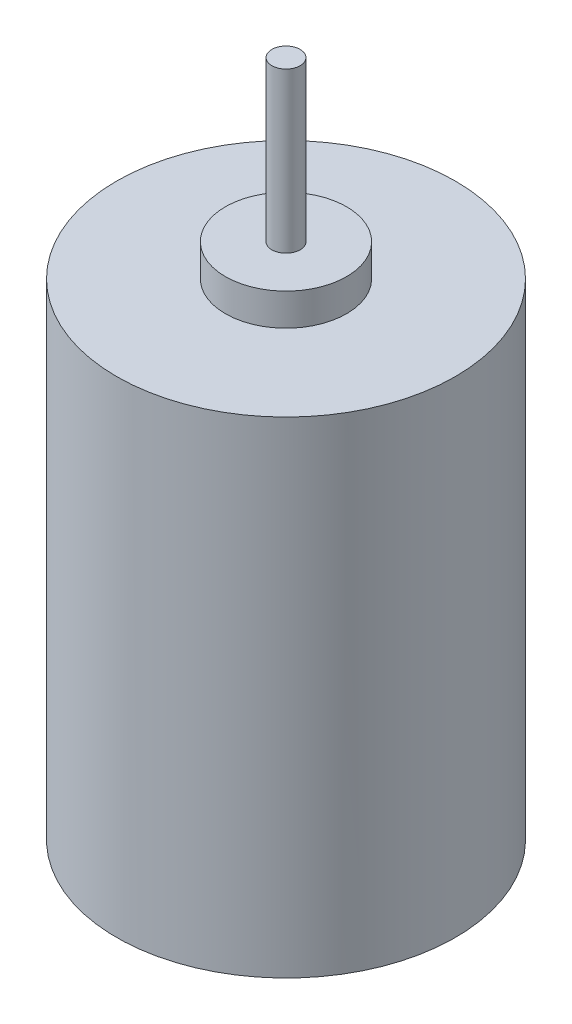
ISO-10303-21;
HEADER;
FILE_DESCRIPTION(('STEP AP214'),'2;1');
FILE_NAME('part.step','',(''),(''),'','','');
FILE_SCHEMA(('AUTOMOTIVE_DESIGN { 1 0 10303 214 1 1 1 1 }'));
ENDSEC;
DATA;
#1=APPLICATION_CONTEXT('core data for automotive mechanical design processes');
#2=APPLICATION_PROTOCOL_DEFINITION('international standard','automotive_design',2000,#1);
#3=PRODUCT_CONTEXT('',#1,'mechanical');
#4=PRODUCT('Part','Part','',(#3));
#5=PRODUCT_RELATED_PRODUCT_CATEGORY('part','',(#4));
#6=PRODUCT_DEFINITION_FORMATION('','',#4);
#7=PRODUCT_DEFINITION_CONTEXT('part definition',#1,'design');
#8=PRODUCT_DEFINITION('design','',#6,#7);
#9=PRODUCT_DEFINITION_SHAPE('','',#8);
#10=(LENGTH_UNIT() NAMED_UNIT(*) SI_UNIT(.MILLI.,.METRE.));
#11=(NAMED_UNIT(*) PLANE_ANGLE_UNIT() SI_UNIT($,.RADIAN.));
#12=(NAMED_UNIT(*) SI_UNIT($,.STERADIAN.) SOLID_ANGLE_UNIT());
#13=UNCERTAINTY_MEASURE_WITH_UNIT(LENGTH_MEASURE(1.E-05),#10,'distance_accuracy_value','');
#14=(GEOMETRIC_REPRESENTATION_CONTEXT(3) GLOBAL_UNCERTAINTY_ASSIGNED_CONTEXT((#13)) GLOBAL_UNIT_ASSIGNED_CONTEXT((#10,
#11,#12)) REPRESENTATION_CONTEXT('',''));
#15=CARTESIAN_POINT('',(0.,0.,0.));
#16=DIRECTION('',(0.,0.,1.));
#17=DIRECTION('',(1.,0.,0.));
#18=AXIS2_PLACEMENT_3D('',#15,#16,#17);
#19=CARTESIAN_POINT('',(0.,57.000000046,0.));
#20=DIRECTION('',(0.,-1.,0.));
#21=DIRECTION('',(0.,0.,-1.));
#22=AXIS2_PLACEMENT_3D('',#19,#20,#21);
#23=CYLINDRICAL_SURFACE('',#22,13.700000032);
#24=CARTESIAN_POINT('',(0.,41.499999804,0.));
#25=DIRECTION('',(0.,1.,0.));
#26=DIRECTION('',(0.,0.,1.));
#27=AXIS2_PLACEMENT_3D('',#24,#25,#26);
#28=CIRCLE('',#27,13.700000032);
#29=CARTESIAN_POINT('',(0.,41.499999804,13.700000032));
#30=VERTEX_POINT('',#29);
#31=EDGE_CURVE('E48',#30,#30,#28,.T.);
#32=ORIENTED_EDGE('',*,*,#31,.F.);
#33=EDGE_LOOP('',(#32));
#34=FACE_BOUND('',#33,.T.);
#35=CARTESIAN_POINT('',(0.,2.200000172,0.));
#36=DIRECTION('',(0.,-1.,0.));
#37=DIRECTION('',(0.,0.,-1.));
#38=AXIS2_PLACEMENT_3D('',#35,#36,#37);
#39=CIRCLE('',#38,13.700000032);
#40=CARTESIAN_POINT('',(0.,2.200000172,-13.700000032));
#41=VERTEX_POINT('',#40);
#42=EDGE_CURVE('E39',#41,#41,#39,.T.);
#43=ORIENTED_EDGE('',*,*,#42,.F.);
#44=EDGE_LOOP('',(#43));
#45=FACE_BOUND('',#44,.T.);
#46=ADVANCED_FACE('F36',(#34,#45),#23,.T.);
#47=CARTESIAN_POINT('',(0.,44.099999938,0.));
#48=DIRECTION('',(0.,1.,0.));
#49=DIRECTION('',(0.,0.,1.));
#50=AXIS2_PLACEMENT_3D('',#47,#48,#49);
#51=PLANE('',#50);
#52=CARTESIAN_POINT('',(0.,44.099999938,0.));
#53=DIRECTION('',(0.,1.,0.));
#54=DIRECTION('',(0.,0.,1.));
#55=AXIS2_PLACEMENT_3D('',#52,#53,#54);
#56=CIRCLE('',#55,1.143);
#57=CARTESIAN_POINT('',(0.,44.099999938,1.143));
#58=VERTEX_POINT('',#57);
#59=EDGE_CURVE('E11',#58,#58,#56,.T.);
#60=ORIENTED_EDGE('',*,*,#59,.F.);
#61=EDGE_LOOP('',(#60));
#62=FACE_BOUND('',#61,.T.);
#63=CARTESIAN_POINT('',(0.,44.099999938,0.));
#64=DIRECTION('',(0.,1.,0.));
#65=DIRECTION('',(0.,0.,1.));
#66=AXIS2_PLACEMENT_3D('',#63,#64,#65);
#67=CIRCLE('',#66,4.899999979);
#68=CARTESIAN_POINT('',(0.,44.099999938,4.899999979));
#69=VERTEX_POINT('',#68);
#70=EDGE_CURVE('E51',#69,#69,#67,.T.);
#71=ORIENTED_EDGE('',*,*,#70,.T.);
#72=EDGE_LOOP('',(#71));
#73=FACE_BOUND('',#72,.T.);
#74=ADVANCED_FACE('F78',(#62,#73),#51,.T.);
#75=CARTESIAN_POINT('',(0.,44.099999938,0.));
#76=DIRECTION('',(0.,1.,0.));
#77=DIRECTION('',(0.,0.,1.));
#78=AXIS2_PLACEMENT_3D('',#75,#76,#77);
#79=CYLINDRICAL_SURFACE('',#78,1.143);
#80=ORIENTED_EDGE('',*,*,#59,.T.);
#81=EDGE_LOOP('',(#80));
#82=FACE_BOUND('',#81,.T.);
#83=CARTESIAN_POINT('',(0.,57.000000046,0.));
#84=DIRECTION('',(0.,1.,0.));
#85=DIRECTION('',(0.,0.,1.));
#86=AXIS2_PLACEMENT_3D('',#83,#84,#85);
#87=CIRCLE('',#86,1.143);
#88=CARTESIAN_POINT('',(0.,57.000000046,1.143));
#89=VERTEX_POINT('',#88);
#90=EDGE_CURVE('E43',#89,#89,#87,.T.);
#91=ORIENTED_EDGE('',*,*,#90,.F.);
#92=EDGE_LOOP('',(#91));
#93=FACE_BOUND('',#92,.T.);
#94=ADVANCED_FACE('F101',(#82,#93),#79,.T.);
#95=CARTESIAN_POINT('',(0.,57.000000046,0.));
#96=DIRECTION('',(0.,1.,0.));
#97=DIRECTION('',(0.,0.,1.));
#98=AXIS2_PLACEMENT_3D('',#95,#96,#97);
#99=PLANE('',#98);
#100=ORIENTED_EDGE('',*,*,#90,.T.);
#101=EDGE_LOOP('',(#100));
#102=FACE_BOUND('',#101,.T.);
#103=ADVANCED_FACE('F92',(#102),#99,.T.);
#104=CARTESIAN_POINT('',(0.,41.499999804,0.));
#105=DIRECTION('',(0.,1.,0.));
#106=DIRECTION('',(0.,0.,1.));
#107=AXIS2_PLACEMENT_3D('',#104,#105,#106);
#108=PLANE('',#107);
#109=CARTESIAN_POINT('',(0.,41.499999804,0.));
#110=DIRECTION('',(0.,1.,0.));
#111=DIRECTION('',(0.,0.,1.));
#112=AXIS2_PLACEMENT_3D('',#109,#110,#111);
#113=CIRCLE('',#112,4.899999979);
#114=CARTESIAN_POINT('',(0.,41.499999804,4.899999979));
#115=VERTEX_POINT('',#114);
#116=EDGE_CURVE('E55',#115,#115,#113,.T.);
#117=ORIENTED_EDGE('',*,*,#116,.F.);
#118=EDGE_LOOP('',(#117));
#119=FACE_BOUND('',#118,.T.);
#120=ORIENTED_EDGE('',*,*,#31,.T.);
#121=EDGE_LOOP('',(#120));
#122=FACE_BOUND('',#121,.T.);
#123=ADVANCED_FACE('F83',(#119,#122),#108,.T.);
#124=CARTESIAN_POINT('',(0.,41.499999804,0.));
#125=DIRECTION('',(0.,1.,0.));
#126=DIRECTION('',(0.,0.,1.));
#127=AXIS2_PLACEMENT_3D('',#124,#125,#126);
#128=CYLINDRICAL_SURFACE('',#127,4.899999979);
#129=CARTESIAN_POINT('',(0.,41.499999804,4.899999979));
#130=CARTESIAN_POINT('',(0.,41.5270831387292,4.899999979));
#131=CARTESIAN_POINT('',(0.,41.5541664734583,4.899999979));
#132=CARTESIAN_POINT('',(0.,41.6083331429167,4.899999979));
#133=CARTESIAN_POINT('',(0.,41.6354164776458,4.899999979));
#134=CARTESIAN_POINT('',(0.,41.6895831471042,4.899999979));
#135=CARTESIAN_POINT('',(0.,41.7166664818333,4.899999979));
#136=CARTESIAN_POINT('',(0.,41.7708331512917,4.899999979));
#137=CARTESIAN_POINT('',(0.,41.7979164860208,4.899999979));
#138=CARTESIAN_POINT('',(0.,41.8520831554792,4.899999979));
#139=CARTESIAN_POINT('',(0.,41.8791664902083,4.899999979));
#140=CARTESIAN_POINT('',(0.,41.9333331596667,4.899999979));
#141=CARTESIAN_POINT('',(0.,41.9604164943958,4.899999979));
#142=CARTESIAN_POINT('',(0.,42.0145831638542,4.899999979));
#143=CARTESIAN_POINT('',(0.,42.0416664985833,4.899999979));
#144=CARTESIAN_POINT('',(0.,42.0958331680417,4.899999979));
#145=CARTESIAN_POINT('',(0.,42.1229165027708,4.899999979));
#146=CARTESIAN_POINT('',(0.,42.1770831722292,4.899999979));
#147=CARTESIAN_POINT('',(0.,42.2041665069583,4.899999979));
#148=CARTESIAN_POINT('',(0.,42.2583331764167,4.899999979));
#149=CARTESIAN_POINT('',(0.,42.2854165111458,4.899999979));
#150=CARTESIAN_POINT('',(0.,42.3395831806042,4.899999979));
#151=CARTESIAN_POINT('',(0.,42.3666665153333,4.899999979));
#152=CARTESIAN_POINT('',(0.,42.4208331847917,4.899999979));
#153=CARTESIAN_POINT('',(0.,42.4479165195208,4.899999979));
#154=CARTESIAN_POINT('',(0.,42.5020831889792,4.899999979));
#155=CARTESIAN_POINT('',(0.,42.5291665237083,4.899999979));
#156=CARTESIAN_POINT('',(0.,42.5833331931667,4.899999979));
#157=CARTESIAN_POINT('',(0.,42.6104165278958,4.899999979));
#158=CARTESIAN_POINT('',(0.,42.6645831973542,4.899999979));
#159=CARTESIAN_POINT('',(0.,42.6916665320833,4.899999979));
#160=CARTESIAN_POINT('',(0.,42.7458332015417,4.899999979));
#161=CARTESIAN_POINT('',(0.,42.7729165362708,4.899999979));
#162=CARTESIAN_POINT('',(0.,42.8270832057292,4.899999979));
#163=CARTESIAN_POINT('',(0.,42.8541665404583,4.899999979));
#164=CARTESIAN_POINT('',(0.,42.9083332099167,4.899999979));
#165=CARTESIAN_POINT('',(0.,42.9354165446458,4.899999979));
#166=CARTESIAN_POINT('',(0.,42.9895832141042,4.899999979));
#167=CARTESIAN_POINT('',(0.,43.0166665488333,4.899999979));
#168=CARTESIAN_POINT('',(0.,43.0708332182917,4.899999979));
#169=CARTESIAN_POINT('',(0.,43.0979165530208,4.899999979));
#170=CARTESIAN_POINT('',(0.,43.1520832224792,4.899999979));
#171=CARTESIAN_POINT('',(0.,43.1791665572083,4.899999979));
#172=CARTESIAN_POINT('',(0.,43.2333332266667,4.899999979));
#173=CARTESIAN_POINT('',(0.,43.2604165613958,4.899999979));
#174=CARTESIAN_POINT('',(0.,43.3145832308542,4.899999979));
#175=CARTESIAN_POINT('',(0.,43.3416665655833,4.899999979));
#176=CARTESIAN_POINT('',(0.,43.3958332350417,4.899999979));
#177=CARTESIAN_POINT('',(0.,43.4229165697708,4.899999979));
#178=CARTESIAN_POINT('',(0.,43.4770832392292,4.899999979));
#179=CARTESIAN_POINT('',(0.,43.5041665739583,4.899999979));
#180=CARTESIAN_POINT('',(0.,43.5583332434167,4.899999979));
#181=CARTESIAN_POINT('',(0.,43.5854165781458,4.899999979));
#182=CARTESIAN_POINT('',(0.,43.6395832476042,4.899999979));
#183=CARTESIAN_POINT('',(0.,43.6666665823333,4.899999979));
#184=CARTESIAN_POINT('',(0.,43.7208332517917,4.899999979));
#185=CARTESIAN_POINT('',(0.,43.7479165865208,4.899999979));
#186=CARTESIAN_POINT('',(0.,43.8020832559792,4.899999979));
#187=CARTESIAN_POINT('',(0.,43.8291665907083,4.899999979));
#188=CARTESIAN_POINT('',(0.,43.8833332601667,4.899999979));
#189=CARTESIAN_POINT('',(0.,43.9104165948958,4.899999979));
#190=CARTESIAN_POINT('',(0.,43.9645832643542,4.899999979));
#191=CARTESIAN_POINT('',(0.,43.9916665990833,4.899999979));
#192=CARTESIAN_POINT('',(0.,44.0458332685417,4.899999979));
#193=CARTESIAN_POINT('',(0.,44.0729166032708,4.899999979));
#194=CARTESIAN_POINT('',(0.,44.099999938,4.899999979));
#195=B_SPLINE_CURVE_WITH_KNOTS('',3,(#129,#130,#131,#132,#133,#134,#135,#136,#137,#138,#139,
#140,#141,#142,#143,#144,#145,#146,#147,#148,#149,#150,#151,#152,#153,#154,#155,#156,#157,#158,
#159,#160,#161,#162,#163,#164,#165,#166,#167,#168,#169,#170,#171,#172,#173,#174,#175,#176,#177,
#178,#179,#180,#181,#182,#183,#184,#185,#186,#187,#188,#189,#190,#191,#192,#193,#194),
.UNSPECIFIED.,.F.,.F.,(4,2,2,2,2,2,2,2,2,2,2,2,2,2,2,2,2,2,2,2,2,2,2,2,2,2,2,2,2,2,2,2,4),(0.,
0.0812500041875025,0.162500008375005,0.243750012562501,0.325000016750003,0.406250020937506,
0.487500025125001,0.568750029312504,0.650000033500006,0.731250037687502,0.812500041875004,
0.8937500460625,0.975000050250002,1.0562500544375,1.137500058625,1.2187500628125,
1.30000006700001,1.3812500711875,1.462500075375,1.5437500795625,1.62500008375,1.7062500879375,
1.787500092125,1.8687500963125,1.9500001005,2.0312501046875,2.112500108875,2.1937501130625,
2.27500011725,2.3562501214375,2.437500125625,2.5187501298125,2.600000134),.UNSPECIFIED.);
#196=EDGE_CURVE('BSEAM80',#115,#69,#195,.T.);
#197=ORIENTED_EDGE('',*,*,#116,.T.);
#198=ORIENTED_EDGE('',*,*,#70,.F.);
#199=ORIENTED_EDGE('',*,*,#196,.T.);
#200=ORIENTED_EDGE('',*,*,#196,.F.);
#201=EDGE_LOOP('',(#197,#199,#198,#200));
#202=FACE_BOUND('',#201,.T.);
#203=ADVANCED_FACE('F80',(#202),#128,.T.);
#204=CARTESIAN_POINT('',(0.,2.200000172,0.));
#205=DIRECTION('',(0.,-1.,0.));
#206=DIRECTION('',(0.,0.,-1.));
#207=AXIS2_PLACEMENT_3D('',#204,#205,#206);
#208=PLANE('',#207);
#209=CARTESIAN_POINT('',(0.,2.200000172,0.));
#210=DIRECTION('',(0.,-1.,0.));
#211=DIRECTION('',(0.,0.,-1.));
#212=AXIS2_PLACEMENT_3D('',#209,#210,#211);
#213=CIRCLE('',#212,4.899999979);
#214=CARTESIAN_POINT('',(0.,2.200000172,-4.899999979));
#215=VERTEX_POINT('',#214);
#216=EDGE_CURVE('E58',#215,#215,#213,.T.);
#217=ORIENTED_EDGE('',*,*,#216,.F.);
#218=EDGE_LOOP('',(#217));
#219=FACE_BOUND('',#218,.T.);
#220=ORIENTED_EDGE('',*,*,#42,.T.);
#221=EDGE_LOOP('',(#220));
#222=FACE_BOUND('',#221,.T.);
#223=ADVANCED_FACE('F82',(#219,#222),#208,.T.);
#224=CARTESIAN_POINT('',(0.,2.200000172,0.));
#225=DIRECTION('',(0.,-1.,0.));
#226=DIRECTION('',(0.,0.,-1.));
#227=AXIS2_PLACEMENT_3D('',#224,#225,#226);
#228=CYLINDRICAL_SURFACE('',#227,4.899999979);
#229=CARTESIAN_POINT('',(0.,1.299999686,0.));
#230=DIRECTION('',(0.,-1.,0.));
#231=DIRECTION('',(0.,0.,-1.));
#232=AXIS2_PLACEMENT_3D('',#229,#230,#231);
#233=CIRCLE('',#232,4.899999979);
#234=CARTESIAN_POINT('',(0.,1.299999686,-4.899999979));
#235=VERTEX_POINT('',#234);
#236=EDGE_CURVE('E56',#235,#235,#233,.T.);
#237=ORIENTED_EDGE('',*,*,#236,.F.);
#238=EDGE_LOOP('',(#237));
#239=FACE_BOUND('',#238,.T.);
#240=ORIENTED_EDGE('',*,*,#216,.T.);
#241=EDGE_LOOP('',(#240));
#242=FACE_BOUND('',#241,.T.);
#243=ADVANCED_FACE('F89',(#239,#242),#228,.T.);
#244=CARTESIAN_POINT('',(0.,0.,0.));
#245=DIRECTION('',(0.,1.,0.));
#246=DIRECTION('',(0.,0.,1.));
#247=AXIS2_PLACEMENT_3D('',#244,#245,#246);
#248=PLANE('',#247);
#249=CARTESIAN_POINT('',(0.,0.,0.));
#250=DIRECTION('',(0.,-1.,0.));
#251=DIRECTION('',(0.,0.,-1.));
#252=AXIS2_PLACEMENT_3D('',#249,#250,#251);
#253=CIRCLE('',#252,1.099999959);
#254=CARTESIAN_POINT('',(0.,0.,-1.099999959));
#255=VERTEX_POINT('',#254);
#256=EDGE_CURVE('E62',#255,#255,#253,.T.);
#257=ORIENTED_EDGE('',*,*,#256,.T.);
#258=EDGE_LOOP('',(#257));
#259=FACE_BOUND('',#258,.T.);
#260=ADVANCED_FACE('F116',(#259),#248,.F.);
#261=CARTESIAN_POINT('',(0.,1.299999686,0.));
#262=DIRECTION('',(0.,-1.,0.));
#263=DIRECTION('',(0.,0.,-1.));
#264=AXIS2_PLACEMENT_3D('',#261,#262,#263);
#265=CYLINDRICAL_SURFACE('',#264,1.099999959);
#266=CARTESIAN_POINT('',(0.,1.299999686,0.));
#267=DIRECTION('',(0.,-1.,0.));
#268=DIRECTION('',(0.,0.,-1.));
#269=AXIS2_PLACEMENT_3D('',#266,#267,#268);
#270=CIRCLE('',#269,1.099999959);
#271=CARTESIAN_POINT('',(0.,1.299999686,-1.099999959));
#272=VERTEX_POINT('',#271);
#273=EDGE_CURVE('E68',#272,#272,#270,.T.);
#274=ORIENTED_EDGE('',*,*,#273,.T.);
#275=EDGE_LOOP('',(#274));
#276=FACE_BOUND('',#275,.T.);
#277=ORIENTED_EDGE('',*,*,#256,.F.);
#278=EDGE_LOOP('',(#277));
#279=FACE_BOUND('',#278,.T.);
#280=ADVANCED_FACE('F118',(#276,#279),#265,.T.);
#281=CARTESIAN_POINT('',(0.,1.299999686,0.));
#282=DIRECTION('',(0.,-1.,0.));
#283=DIRECTION('',(0.,0.,-1.));
#284=AXIS2_PLACEMENT_3D('',#281,#282,#283);
#285=PLANE('',#284);
#286=ORIENTED_EDGE('',*,*,#273,.F.);
#287=EDGE_LOOP('',(#286));
#288=FACE_BOUND('',#287,.T.);
#289=ORIENTED_EDGE('',*,*,#236,.T.);
#290=EDGE_LOOP('',(#289));
#291=FACE_BOUND('',#290,.T.);
#292=ADVANCED_FACE('F124',(#288,#291),#285,.T.);
#293=CLOSED_SHELL('',(#46,#74,#94,#103,#123,#203,#223,#243,#260,#280,#292));
#294=MANIFOLD_SOLID_BREP('B2',#293);
#295=ADVANCED_BREP_SHAPE_REPRESENTATION('',(#18,#294),#14);
#296=SHAPE_DEFINITION_REPRESENTATION(#9,#295);
ENDSEC;
END-ISO-10303-21;
